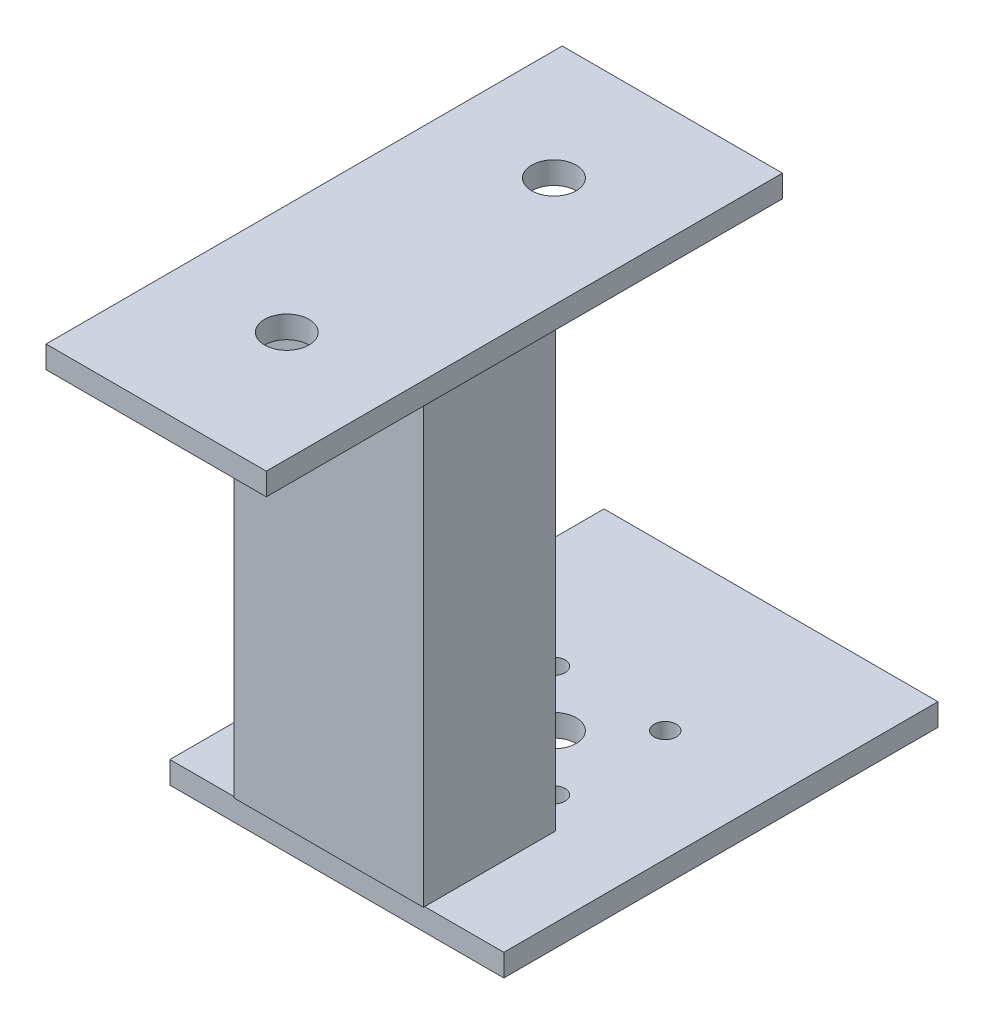
ISO-10303-21;
HEADER;
FILE_DESCRIPTION(('STEP AP214'),'2;1');
FILE_NAME('part.step','',(''),(''),'','','');
FILE_SCHEMA(('AUTOMOTIVE_DESIGN { 1 0 10303 214 1 1 1 1 }'));
ENDSEC;
DATA;
#1=APPLICATION_CONTEXT('core data for automotive mechanical design processes');
#2=APPLICATION_PROTOCOL_DEFINITION('international standard','automotive_design',2000,#1);
#3=PRODUCT_CONTEXT('',#1,'mechanical');
#4=PRODUCT('Part','Part','',(#3));
#5=PRODUCT_RELATED_PRODUCT_CATEGORY('part','',(#4));
#6=PRODUCT_DEFINITION_FORMATION('','',#4);
#7=PRODUCT_DEFINITION_CONTEXT('part definition',#1,'design');
#8=PRODUCT_DEFINITION('design','',#6,#7);
#9=PRODUCT_DEFINITION_SHAPE('','',#8);
#10=(LENGTH_UNIT() NAMED_UNIT(*) SI_UNIT(.MILLI.,.METRE.));
#11=(NAMED_UNIT(*) PLANE_ANGLE_UNIT() SI_UNIT($,.RADIAN.));
#12=(NAMED_UNIT(*) SI_UNIT($,.STERADIAN.) SOLID_ANGLE_UNIT());
#13=UNCERTAINTY_MEASURE_WITH_UNIT(LENGTH_MEASURE(1.E-05),#10,'distance_accuracy_value','');
#14=(GEOMETRIC_REPRESENTATION_CONTEXT(3) GLOBAL_UNCERTAINTY_ASSIGNED_CONTEXT((#13)) GLOBAL_UNIT_ASSIGNED_CONTEXT((#10,
#11,#12)) REPRESENTATION_CONTEXT('',''));
#15=CARTESIAN_POINT('',(0.,0.,0.));
#16=DIRECTION('',(0.,0.,1.));
#17=DIRECTION('',(1.,0.,0.));
#18=AXIS2_PLACEMENT_3D('',#15,#16,#17);
#19=CARTESIAN_POINT('',(0.113330372670362,45.,0.));
#20=DIRECTION('',(-1.,0.,0.));
#21=DIRECTION('',(0.,0.,1.));
#22=AXIS2_PLACEMENT_3D('',#19,#20,#21);
#23=PLANE('',#22);
#24=DIRECTION('',(0.,-1.,0.));
#25=VECTOR('',#24,1.);
#26=CARTESIAN_POINT('',(0.113330372670362,45.,0.115649147058861));
#27=LINE('',#26,#25);
#28=CARTESIAN_POINT('',(0.113330372670362,43.,0.115649147058861));
#29=VERTEX_POINT('',#28);
#30=CARTESIAN_POINT('',(0.113330372670362,2.,0.115649147058861));
#31=VERTEX_POINT('',#30);
#32=EDGE_CURVE('E213',#29,#31,#27,.T.);
#33=ORIENTED_EDGE('',*,*,#32,.F.);
#34=DIRECTION('',(0.,0.,1.));
#35=VECTOR('',#34,1.);
#36=CARTESIAN_POINT('',(0.113330372670362,43.,0.));
#37=LINE('',#36,#35);
#38=CARTESIAN_POINT('',(0.113330372670362,43.,-11.7769551016806));
#39=VERTEX_POINT('',#38);
#40=EDGE_CURVE('E170',#39,#29,#37,.T.);
#41=ORIENTED_EDGE('',*,*,#40,.F.);
#42=DIRECTION('',(0.,-1.,0.));
#43=VECTOR('',#42,1.);
#44=CARTESIAN_POINT('',(0.113330372670362,45.,-11.7769551016806));
#45=LINE('',#44,#43);
#46=CARTESIAN_POINT('',(0.113330372670362,2.,-11.7769551016806));
#47=VERTEX_POINT('',#46);
#48=EDGE_CURVE('E65',#39,#47,#45,.T.);
#49=ORIENTED_EDGE('',*,*,#48,.T.);
#50=DIRECTION('',(0.,0.,-1.));
#51=VECTOR('',#50,1.);
#52=CARTESIAN_POINT('',(0.113330372670362,2.,0.));
#53=LINE('',#52,#51);
#54=CARTESIAN_POINT('',(0.113330372670362,2.,0.));
#55=VERTEX_POINT('',#54);
#56=EDGE_CURVE('E11',#55,#47,#53,.T.);
#57=ORIENTED_EDGE('',*,*,#56,.F.);
#58=EDGE_CURVE('E50',#31,#55,#53,.T.);
#59=ORIENTED_EDGE('',*,*,#58,.F.);
#60=EDGE_LOOP('',(#33,#41,#49,#57,#59));
#61=FACE_BOUND('',#60,.T.);
#62=ADVANCED_FACE('F39',(#61),#23,.T.);
#63=CARTESIAN_POINT('',(0.,45.,0.115649147058861));
#64=DIRECTION('',(0.,0.,-1.));
#65=DIRECTION('',(-1.,0.,0.));
#66=AXIS2_PLACEMENT_3D('',#63,#64,#65);
#67=PLANE('',#66);
#68=DIRECTION('',(1.,0.,0.));
#69=VECTOR('',#68,1.);
#70=CARTESIAN_POINT('',(0.,43.,0.115649147058861));
#71=LINE('',#70,#69);
#72=CARTESIAN_POINT('',(17.1359107011391,43.,0.115649147058861));
#73=VERTEX_POINT('',#72);
#74=EDGE_CURVE('E175',#29,#73,#71,.T.);
#75=ORIENTED_EDGE('',*,*,#74,.F.);
#76=ORIENTED_EDGE('',*,*,#32,.T.);
#77=DIRECTION('',(1.,0.,0.));
#78=VECTOR('',#77,1.);
#79=CARTESIAN_POINT('',(0.,2.,0.115649147058861));
#80=LINE('',#79,#78);
#81=CARTESIAN_POINT('',(17.1359107011391,2.,0.115649147058861));
#82=VERTEX_POINT('',#81);
#83=EDGE_CURVE('E199',#31,#82,#80,.T.);
#84=ORIENTED_EDGE('',*,*,#83,.T.);
#85=DIRECTION('',(0.,-1.,0.));
#86=VECTOR('',#85,1.);
#87=CARTESIAN_POINT('',(17.1359107011391,45.,0.115649147058861));
#88=LINE('',#87,#86);
#89=EDGE_CURVE('E211',#73,#82,#88,.T.);
#90=ORIENTED_EDGE('',*,*,#89,.F.);
#91=EDGE_LOOP('',(#75,#76,#84,#90));
#92=FACE_BOUND('',#91,.T.);
#93=ADVANCED_FACE('F316',(#92),#67,.F.);
#94=CARTESIAN_POINT('',(17.1359107011391,45.,0.));
#95=DIRECTION('',(-1.,0.,0.));
#96=DIRECTION('',(0.,0.,1.));
#97=AXIS2_PLACEMENT_3D('',#94,#95,#96);
#98=PLANE('',#97);
#99=DIRECTION('',(0.,0.,-1.));
#100=VECTOR('',#99,1.);
#101=CARTESIAN_POINT('',(17.1359107011391,43.,0.));
#102=LINE('',#101,#100);
#103=CARTESIAN_POINT('',(17.1359107011391,43.,-11.7769551016806));
#104=VERTEX_POINT('',#103);
#105=EDGE_CURVE('E57',#73,#104,#102,.T.);
#106=ORIENTED_EDGE('',*,*,#105,.F.);
#107=ORIENTED_EDGE('',*,*,#89,.T.);
#108=DIRECTION('',(0.,0.,-1.));
#109=VECTOR('',#108,1.);
#110=CARTESIAN_POINT('',(17.1359107011391,2.,0.));
#111=LINE('',#110,#109);
#112=CARTESIAN_POINT('',(17.1359107011391,2.,0.));
#113=VERTEX_POINT('',#112);
#114=EDGE_CURVE('E202',#82,#113,#111,.T.);
#115=ORIENTED_EDGE('',*,*,#114,.T.);
#116=CARTESIAN_POINT('',(17.1359107011391,2.,-11.7769551016806));
#117=VERTEX_POINT('',#116);
#118=EDGE_CURVE('E48',#113,#117,#111,.T.);
#119=ORIENTED_EDGE('',*,*,#118,.T.);
#120=DIRECTION('',(0.,-1.,0.));
#121=VECTOR('',#120,1.);
#122=CARTESIAN_POINT('',(17.1359107011391,45.,-11.7769551016806));
#123=LINE('',#122,#121);
#124=EDGE_CURVE('E209',#104,#117,#123,.T.);
#125=ORIENTED_EDGE('',*,*,#124,.F.);
#126=EDGE_LOOP('',(#106,#107,#115,#119,#125));
#127=FACE_BOUND('',#126,.T.);
#128=ADVANCED_FACE('F283',(#127),#98,.F.);
#129=CARTESIAN_POINT('',(0.,45.,-11.7769551016806));
#130=DIRECTION('',(0.,0.,-1.));
#131=DIRECTION('',(-1.,0.,0.));
#132=AXIS2_PLACEMENT_3D('',#129,#130,#131);
#133=PLANE('',#132);
#134=ORIENTED_EDGE('',*,*,#48,.F.);
#135=DIRECTION('',(-1.,0.,0.));
#136=VECTOR('',#135,1.);
#137=CARTESIAN_POINT('',(0.,43.,-11.7769551016806));
#138=LINE('',#137,#136);
#139=EDGE_CURVE('E172',#104,#39,#138,.T.);
#140=ORIENTED_EDGE('',*,*,#139,.F.);
#141=ORIENTED_EDGE('',*,*,#124,.T.);
#142=DIRECTION('',(1.,0.,0.));
#143=VECTOR('',#142,1.);
#144=CARTESIAN_POINT('',(0.,2.,-11.7769551016806));
#145=LINE('',#144,#143);
#146=EDGE_CURVE('E205',#47,#117,#145,.T.);
#147=ORIENTED_EDGE('',*,*,#146,.F.);
#148=EDGE_LOOP('',(#134,#140,#141,#147));
#149=FACE_BOUND('',#148,.T.);
#150=ADVANCED_FACE('F328',(#149),#133,.T.);
#151=CARTESIAN_POINT('',(0.,2.,0.));
#152=DIRECTION('',(0.,1.,0.));
#153=DIRECTION('',(0.,0.,1.));
#154=AXIS2_PLACEMENT_3D('',#151,#152,#153);
#155=PLANE('',#154);
#156=CARTESIAN_POINT('',(14.25,2.,-24.5));
#157=DIRECTION('',(0.,1.,0.));
#158=DIRECTION('',(0.,0.,1.));
#159=AXIS2_PLACEMENT_3D('',#156,#157,#158);
#160=CIRCLE('',#159,0.999999999999999);
#161=CARTESIAN_POINT('',(14.25,2.,-23.5));
#162=VERTEX_POINT('',#161);
#163=EDGE_CURVE('E229',#162,#162,#160,.T.);
#164=ORIENTED_EDGE('',*,*,#163,.F.);
#165=EDGE_LOOP('',(#164));
#166=FACE_BOUND('',#165,.T.);
#167=CARTESIAN_POINT('',(4.25000000000003,2.,-24.5));
#168=DIRECTION('',(0.,1.,0.));
#169=DIRECTION('',(0.,0.,1.));
#170=AXIS2_PLACEMENT_3D('',#167,#168,#169);
#171=CIRCLE('',#170,1.);
#172=CARTESIAN_POINT('',(4.25000000000003,2.,-23.5));
#173=VERTEX_POINT('',#172);
#174=EDGE_CURVE('E232',#173,#173,#171,.T.);
#175=ORIENTED_EDGE('',*,*,#174,.F.);
#176=EDGE_LOOP('',(#175));
#177=FACE_BOUND('',#176,.T.);
#178=CARTESIAN_POINT('',(9.24999999999999,2.,-19.5));
#179=DIRECTION('',(0.,1.,0.));
#180=DIRECTION('',(0.,0.,1.));
#181=AXIS2_PLACEMENT_3D('',#178,#179,#180);
#182=CIRCLE('',#181,2.);
#183=CARTESIAN_POINT('',(9.24999999999999,2.,-17.5));
#184=VERTEX_POINT('',#183);
#185=EDGE_CURVE('E235',#184,#184,#182,.T.);
#186=ORIENTED_EDGE('',*,*,#185,.F.);
#187=EDGE_LOOP('',(#186));
#188=FACE_BOUND('',#187,.T.);
#189=CARTESIAN_POINT('',(14.25,2.,-14.5));
#190=DIRECTION('',(0.,1.,0.));
#191=DIRECTION('',(0.,0.,1.));
#192=AXIS2_PLACEMENT_3D('',#189,#190,#191);
#193=CIRCLE('',#192,1.);
#194=CARTESIAN_POINT('',(14.25,2.,-13.5));
#195=VERTEX_POINT('',#194);
#196=EDGE_CURVE('E238',#195,#195,#193,.T.);
#197=ORIENTED_EDGE('',*,*,#196,.F.);
#198=EDGE_LOOP('',(#197));
#199=FACE_BOUND('',#198,.T.);
#200=CARTESIAN_POINT('',(4.24999999999997,2.,-14.5));
#201=DIRECTION('',(0.,1.,0.));
#202=DIRECTION('',(0.,0.,1.));
#203=AXIS2_PLACEMENT_3D('',#200,#201,#202);
#204=CIRCLE('',#203,1.);
#205=CARTESIAN_POINT('',(4.24999999999997,2.,-13.5));
#206=VERTEX_POINT('',#205);
#207=EDGE_CURVE('E241',#206,#206,#204,.T.);
#208=ORIENTED_EDGE('',*,*,#207,.F.);
#209=EDGE_LOOP('',(#208));
#210=FACE_BOUND('',#209,.T.);
#211=DIRECTION('',(-1.,0.,0.));
#212=VECTOR('',#211,1.);
#213=CARTESIAN_POINT('',(0.,2.,0.));
#214=LINE('',#213,#212);
#215=CARTESIAN_POINT('',(-5.75000000000001,2.,0.));
#216=VERTEX_POINT('',#215);
#217=EDGE_CURVE('E221',#55,#216,#214,.T.);
#218=ORIENTED_EDGE('',*,*,#217,.F.);
#219=ORIENTED_EDGE('',*,*,#56,.T.);
#220=ORIENTED_EDGE('',*,*,#146,.T.);
#221=ORIENTED_EDGE('',*,*,#118,.F.);
#222=CARTESIAN_POINT('',(24.25,2.,0.));
#223=VERTEX_POINT('',#222);
#224=EDGE_CURVE('E216',#223,#113,#214,.T.);
#225=ORIENTED_EDGE('',*,*,#224,.F.);
#226=DIRECTION('',(0.,0.,-1.));
#227=VECTOR('',#226,1.);
#228=CARTESIAN_POINT('',(24.25,2.,0.));
#229=LINE('',#228,#227);
#230=CARTESIAN_POINT('',(24.25,2.,-39.));
#231=VERTEX_POINT('',#230);
#232=EDGE_CURVE('E219',#223,#231,#229,.T.);
#233=ORIENTED_EDGE('',*,*,#232,.T.);
#234=DIRECTION('',(1.,0.,0.));
#235=VECTOR('',#234,1.);
#236=CARTESIAN_POINT('',(0.,2.,-39.));
#237=LINE('',#236,#235);
#238=CARTESIAN_POINT('',(-5.75000000000002,2.,-39.));
#239=VERTEX_POINT('',#238);
#240=EDGE_CURVE('E223',#239,#231,#237,.T.);
#241=ORIENTED_EDGE('',*,*,#240,.F.);
#242=DIRECTION('',(0.,0.,-1.));
#243=VECTOR('',#242,1.);
#244=CARTESIAN_POINT('',(-5.75000000000001,2.,0.));
#245=LINE('',#244,#243);
#246=EDGE_CURVE('E226',#216,#239,#245,.T.);
#247=ORIENTED_EDGE('',*,*,#246,.F.);
#248=EDGE_LOOP('',(#218,#219,#220,#221,#225,#233,#241,#247));
#249=FACE_BOUND('',#248,.T.);
#250=ADVANCED_FACE('F287',(#166,#177,#188,#199,#210,#249),#155,.T.);
#251=CARTESIAN_POINT('',(0.,2.,0.));
#252=DIRECTION('',(0.,0.,1.));
#253=DIRECTION('',(1.,0.,0.));
#254=AXIS2_PLACEMENT_3D('',#251,#252,#253);
#255=PLANE('',#254);
#256=DIRECTION('',(-1.,0.,0.));
#257=VECTOR('',#256,1.);
#258=CARTESIAN_POINT('',(0.,0.,0.));
#259=LINE('',#258,#257);
#260=CARTESIAN_POINT('',(24.25,0.,0.));
#261=VERTEX_POINT('',#260);
#262=CARTESIAN_POINT('',(-5.75000000000001,0.,0.));
#263=VERTEX_POINT('',#262);
#264=EDGE_CURVE('E215',#261,#263,#259,.T.);
#265=ORIENTED_EDGE('',*,*,#264,.F.);
#266=DIRECTION('',(0.,-1.,0.));
#267=VECTOR('',#266,1.);
#268=CARTESIAN_POINT('',(24.25,2.,0.));
#269=LINE('',#268,#267);
#270=EDGE_CURVE('E43',#223,#261,#269,.T.);
#271=ORIENTED_EDGE('',*,*,#270,.F.);
#272=ORIENTED_EDGE('',*,*,#224,.T.);
#273=EDGE_CURVE('E220',#113,#55,#214,.T.);
#274=ORIENTED_EDGE('',*,*,#273,.T.);
#275=ORIENTED_EDGE('',*,*,#217,.T.);
#276=DIRECTION('',(0.,-1.,0.));
#277=VECTOR('',#276,1.);
#278=CARTESIAN_POINT('',(-5.75000000000001,2.,0.));
#279=LINE('',#278,#277);
#280=EDGE_CURVE('E244',#216,#263,#279,.T.);
#281=ORIENTED_EDGE('',*,*,#280,.T.);
#282=EDGE_LOOP('',(#265,#271,#272,#274,#275,#281));
#283=FACE_BOUND('',#282,.T.);
#284=ADVANCED_FACE('F41',(#283),#255,.T.);
#285=CARTESIAN_POINT('',(24.25,2.,0.));
#286=DIRECTION('',(-1.,0.,0.));
#287=DIRECTION('',(0.,0.,1.));
#288=AXIS2_PLACEMENT_3D('',#285,#286,#287);
#289=PLANE('',#288);
#290=DIRECTION('',(0.,0.,-1.));
#291=VECTOR('',#290,1.);
#292=CARTESIAN_POINT('',(24.25,0.,0.));
#293=LINE('',#292,#291);
#294=CARTESIAN_POINT('',(24.25,0.,-39.));
#295=VERTEX_POINT('',#294);
#296=EDGE_CURVE('E247',#261,#295,#293,.T.);
#297=ORIENTED_EDGE('',*,*,#296,.T.);
#298=DIRECTION('',(0.,-1.,0.));
#299=VECTOR('',#298,1.);
#300=CARTESIAN_POINT('',(24.25,2.,-39.));
#301=LINE('',#300,#299);
#302=EDGE_CURVE('E273',#231,#295,#301,.T.);
#303=ORIENTED_EDGE('',*,*,#302,.F.);
#304=ORIENTED_EDGE('',*,*,#232,.F.);
#305=ORIENTED_EDGE('',*,*,#270,.T.);
#306=EDGE_LOOP('',(#297,#303,#304,#305));
#307=FACE_BOUND('',#306,.T.);
#308=ADVANCED_FACE('F307',(#307),#289,.F.);
#309=CARTESIAN_POINT('',(0.,2.,-39.));
#310=DIRECTION('',(0.,0.,-1.));
#311=DIRECTION('',(-1.,0.,0.));
#312=AXIS2_PLACEMENT_3D('',#309,#310,#311);
#313=PLANE('',#312);
#314=DIRECTION('',(1.,0.,0.));
#315=VECTOR('',#314,1.);
#316=CARTESIAN_POINT('',(0.,0.,-39.));
#317=LINE('',#316,#315);
#318=CARTESIAN_POINT('',(-5.75000000000002,0.,-39.));
#319=VERTEX_POINT('',#318);
#320=EDGE_CURVE('E250',#319,#295,#317,.T.);
#321=ORIENTED_EDGE('',*,*,#320,.F.);
#322=DIRECTION('',(0.,-1.,0.));
#323=VECTOR('',#322,1.);
#324=CARTESIAN_POINT('',(-5.75000000000002,2.,-39.));
#325=LINE('',#324,#323);
#326=EDGE_CURVE('E272',#239,#319,#325,.T.);
#327=ORIENTED_EDGE('',*,*,#326,.F.);
#328=ORIENTED_EDGE('',*,*,#240,.T.);
#329=ORIENTED_EDGE('',*,*,#302,.T.);
#330=EDGE_LOOP('',(#321,#327,#328,#329));
#331=FACE_BOUND('',#330,.T.);
#332=ADVANCED_FACE('F303',(#331),#313,.T.);
#333=CARTESIAN_POINT('',(14.25,2.,-14.5));
#334=DIRECTION('',(0.,-1.,0.));
#335=DIRECTION('',(0.,0.,-1.));
#336=AXIS2_PLACEMENT_3D('',#333,#334,#335);
#337=CYLINDRICAL_SURFACE('',#336,1.);
#338=ORIENTED_EDGE('',*,*,#196,.T.);
#339=EDGE_LOOP('',(#338));
#340=FACE_BOUND('',#339,.T.);
#341=CARTESIAN_POINT('',(14.25,0.,-14.5));
#342=DIRECTION('',(0.,1.,0.));
#343=DIRECTION('',(0.,0.,1.));
#344=AXIS2_PLACEMENT_3D('',#341,#342,#343);
#345=CIRCLE('',#344,1.);
#346=CARTESIAN_POINT('',(14.25,0.,-13.5));
#347=VERTEX_POINT('',#346);
#348=EDGE_CURVE('E265',#347,#347,#345,.T.);
#349=ORIENTED_EDGE('',*,*,#348,.F.);
#350=EDGE_LOOP('',(#349));
#351=FACE_BOUND('',#350,.T.);
#352=ADVANCED_FACE('F313',(#340,#351),#337,.F.);
#353=CARTESIAN_POINT('',(9.24999999999999,2.,-19.5));
#354=DIRECTION('',(0.,-1.,0.));
#355=DIRECTION('',(0.,0.,-1.));
#356=AXIS2_PLACEMENT_3D('',#353,#354,#355);
#357=CYLINDRICAL_SURFACE('',#356,2.);
#358=ORIENTED_EDGE('',*,*,#185,.T.);
#359=EDGE_LOOP('',(#358));
#360=FACE_BOUND('',#359,.T.);
#361=CARTESIAN_POINT('',(9.24999999999999,0.,-19.5));
#362=DIRECTION('',(0.,1.,0.));
#363=DIRECTION('',(0.,0.,1.));
#364=AXIS2_PLACEMENT_3D('',#361,#362,#363);
#365=CIRCLE('',#364,2.);
#366=CARTESIAN_POINT('',(9.24999999999999,0.,-17.5));
#367=VERTEX_POINT('',#366);
#368=EDGE_CURVE('E262',#367,#367,#365,.T.);
#369=ORIENTED_EDGE('',*,*,#368,.F.);
#370=EDGE_LOOP('',(#369));
#371=FACE_BOUND('',#370,.T.);
#372=ADVANCED_FACE('F338',(#360,#371),#357,.F.);
#373=CARTESIAN_POINT('',(4.25000000000003,2.,-24.5));
#374=DIRECTION('',(0.,-1.,0.));
#375=DIRECTION('',(0.,0.,-1.));
#376=AXIS2_PLACEMENT_3D('',#373,#374,#375);
#377=CYLINDRICAL_SURFACE('',#376,1.);
#378=ORIENTED_EDGE('',*,*,#174,.T.);
#379=EDGE_LOOP('',(#378));
#380=FACE_BOUND('',#379,.T.);
#381=CARTESIAN_POINT('',(4.25000000000003,0.,-24.5));
#382=DIRECTION('',(0.,1.,0.));
#383=DIRECTION('',(0.,0.,1.));
#384=AXIS2_PLACEMENT_3D('',#381,#382,#383);
#385=CIRCLE('',#384,1.);
#386=CARTESIAN_POINT('',(4.25000000000003,0.,-23.5));
#387=VERTEX_POINT('',#386);
#388=EDGE_CURVE('E259',#387,#387,#385,.T.);
#389=ORIENTED_EDGE('',*,*,#388,.F.);
#390=EDGE_LOOP('',(#389));
#391=FACE_BOUND('',#390,.T.);
#392=ADVANCED_FACE('F342',(#380,#391),#377,.F.);
#393=CARTESIAN_POINT('',(14.25,2.,-24.5));
#394=DIRECTION('',(0.,-1.,0.));
#395=DIRECTION('',(0.,0.,-1.));
#396=AXIS2_PLACEMENT_3D('',#393,#394,#395);
#397=CYLINDRICAL_SURFACE('',#396,0.999999999999999);
#398=ORIENTED_EDGE('',*,*,#163,.T.);
#399=EDGE_LOOP('',(#398));
#400=FACE_BOUND('',#399,.T.);
#401=CARTESIAN_POINT('',(14.25,0.,-24.5));
#402=DIRECTION('',(0.,1.,0.));
#403=DIRECTION('',(0.,0.,1.));
#404=AXIS2_PLACEMENT_3D('',#401,#402,#403);
#405=CIRCLE('',#404,0.999999999999999);
#406=CARTESIAN_POINT('',(14.25,0.,-23.5));
#407=VERTEX_POINT('',#406);
#408=EDGE_CURVE('E256',#407,#407,#405,.T.);
#409=ORIENTED_EDGE('',*,*,#408,.F.);
#410=EDGE_LOOP('',(#409));
#411=FACE_BOUND('',#410,.T.);
#412=ADVANCED_FACE('F346',(#400,#411),#397,.F.);
#413=CARTESIAN_POINT('',(-5.75000000000001,2.,0.));
#414=DIRECTION('',(-1.,0.,0.));
#415=DIRECTION('',(0.,0.,1.));
#416=AXIS2_PLACEMENT_3D('',#413,#414,#415);
#417=PLANE('',#416);
#418=DIRECTION('',(0.,0.,-1.));
#419=VECTOR('',#418,1.);
#420=CARTESIAN_POINT('',(-5.75000000000001,0.,0.));
#421=LINE('',#420,#419);
#422=EDGE_CURVE('E253',#263,#319,#421,.T.);
#423=ORIENTED_EDGE('',*,*,#422,.F.);
#424=ORIENTED_EDGE('',*,*,#280,.F.);
#425=ORIENTED_EDGE('',*,*,#246,.T.);
#426=ORIENTED_EDGE('',*,*,#326,.T.);
#427=EDGE_LOOP('',(#423,#424,#425,#426));
#428=FACE_BOUND('',#427,.T.);
#429=ADVANCED_FACE('F301',(#428),#417,.T.);
#430=CARTESIAN_POINT('',(4.24999999999997,2.,-14.5));
#431=DIRECTION('',(0.,-1.,0.));
#432=DIRECTION('',(0.,0.,-1.));
#433=AXIS2_PLACEMENT_3D('',#430,#431,#432);
#434=CYLINDRICAL_SURFACE('',#433,1.);
#435=ORIENTED_EDGE('',*,*,#207,.T.);
#436=EDGE_LOOP('',(#435));
#437=FACE_BOUND('',#436,.T.);
#438=CARTESIAN_POINT('',(4.24999999999997,0.,-14.5));
#439=DIRECTION('',(0.,1.,0.));
#440=DIRECTION('',(0.,0.,1.));
#441=AXIS2_PLACEMENT_3D('',#438,#439,#440);
#442=CIRCLE('',#441,1.);
#443=CARTESIAN_POINT('',(4.24999999999997,0.,-13.5));
#444=VERTEX_POINT('',#443);
#445=EDGE_CURVE('E268',#444,#444,#442,.T.);
#446=ORIENTED_EDGE('',*,*,#445,.F.);
#447=EDGE_LOOP('',(#446));
#448=FACE_BOUND('',#447,.T.);
#449=ADVANCED_FACE('F332',(#437,#448),#434,.F.);
#450=CARTESIAN_POINT('',(0.,0.,0.));
#451=DIRECTION('',(0.,1.,0.));
#452=DIRECTION('',(0.,0.,1.));
#453=AXIS2_PLACEMENT_3D('',#450,#451,#452);
#454=PLANE('',#453);
#455=ORIENTED_EDGE('',*,*,#264,.T.);
#456=ORIENTED_EDGE('',*,*,#422,.T.);
#457=ORIENTED_EDGE('',*,*,#320,.T.);
#458=ORIENTED_EDGE('',*,*,#296,.F.);
#459=EDGE_LOOP('',(#455,#456,#457,#458));
#460=FACE_BOUND('',#459,.T.);
#461=ORIENTED_EDGE('',*,*,#408,.T.);
#462=EDGE_LOOP('',(#461));
#463=FACE_BOUND('',#462,.T.);
#464=ORIENTED_EDGE('',*,*,#388,.T.);
#465=EDGE_LOOP('',(#464));
#466=FACE_BOUND('',#465,.T.);
#467=ORIENTED_EDGE('',*,*,#368,.T.);
#468=EDGE_LOOP('',(#467));
#469=FACE_BOUND('',#468,.T.);
#470=ORIENTED_EDGE('',*,*,#348,.T.);
#471=EDGE_LOOP('',(#470));
#472=FACE_BOUND('',#471,.T.);
#473=ORIENTED_EDGE('',*,*,#445,.T.);
#474=EDGE_LOOP('',(#473));
#475=FACE_BOUND('',#474,.T.);
#476=ADVANCED_FACE('F305',(#460,#463,#466,#469,#472,#475),#454,.F.);
#477=CARTESIAN_POINT('',(0.,2.,0.));
#478=DIRECTION('',(0.,1.,0.));
#479=DIRECTION('',(0.,0.,1.));
#480=AXIS2_PLACEMENT_3D('',#477,#478,#479);
#481=PLANE('',#480);
#482=ORIENTED_EDGE('',*,*,#273,.F.);
#483=ORIENTED_EDGE('',*,*,#114,.F.);
#484=ORIENTED_EDGE('',*,*,#83,.F.);
#485=ORIENTED_EDGE('',*,*,#58,.T.);
#486=EDGE_LOOP('',(#482,#483,#484,#485));
#487=FACE_BOUND('',#486,.T.);
#488=ADVANCED_FACE('F294',(#487),#481,.F.);
#489=CARTESIAN_POINT('',(-0.643100003960378,43.,0.));
#490=DIRECTION('',(1.,0.,0.));
#491=DIRECTION('',(0.,0.,-1.));
#492=AXIS2_PLACEMENT_3D('',#489,#490,#491);
#493=PLANE('',#492);
#494=DIRECTION('',(0.,0.,-1.));
#495=VECTOR('',#494,1.);
#496=CARTESIAN_POINT('',(-0.643100003960378,45.,0.));
#497=LINE('',#496,#495);
#498=CARTESIAN_POINT('',(-0.643100003960378,45.,16.2352326791861));
#499=VERTEX_POINT('',#498);
#500=CARTESIAN_POINT('',(-0.643100003960378,45.,-30.1380604420363));
#501=VERTEX_POINT('',#500);
#502=EDGE_CURVE('E182',#499,#501,#497,.T.);
#503=ORIENTED_EDGE('',*,*,#502,.T.);
#504=DIRECTION('',(0.,1.,0.));
#505=VECTOR('',#504,1.);
#506=CARTESIAN_POINT('',(-0.643100003960378,43.,-30.1380604420363));
#507=LINE('',#506,#505);
#508=CARTESIAN_POINT('',(-0.643100003960378,43.,-30.1380604420363));
#509=VERTEX_POINT('',#508);
#510=EDGE_CURVE('E154',#509,#501,#507,.T.);
#511=ORIENTED_EDGE('',*,*,#510,.F.);
#512=DIRECTION('',(0.,0.,-1.));
#513=VECTOR('',#512,1.);
#514=CARTESIAN_POINT('',(-0.643100003960378,43.,0.));
#515=LINE('',#514,#513);
#516=CARTESIAN_POINT('',(-0.643100003960378,43.,16.2352326791861));
#517=VERTEX_POINT('',#516);
#518=EDGE_CURVE('E152',#517,#509,#515,.T.);
#519=ORIENTED_EDGE('',*,*,#518,.F.);
#520=DIRECTION('',(0.,1.,0.));
#521=VECTOR('',#520,1.);
#522=CARTESIAN_POINT('',(-0.643100003960378,43.,16.2352326791861));
#523=LINE('',#522,#521);
#524=EDGE_CURVE('E138',#517,#499,#523,.T.);
#525=ORIENTED_EDGE('',*,*,#524,.T.);
#526=EDGE_LOOP('',(#503,#511,#519,#525));
#527=FACE_BOUND('',#526,.T.);
#528=ADVANCED_FACE('F153',(#527),#493,.F.);
#529=CARTESIAN_POINT('',(0.,43.,-30.1380604420363));
#530=DIRECTION('',(0.,0.,-1.));
#531=DIRECTION('',(-1.,0.,0.));
#532=AXIS2_PLACEMENT_3D('',#529,#530,#531);
#533=PLANE('',#532);
#534=DIRECTION('',(-1.,0.,0.));
#535=VECTOR('',#534,1.);
#536=CARTESIAN_POINT('',(0.,45.,-30.1380604420363));
#537=LINE('',#536,#535);
#538=CARTESIAN_POINT('',(19.1431000039604,45.,-30.1380604420363));
#539=VERTEX_POINT('',#538);
#540=EDGE_CURVE('E188',#539,#501,#537,.T.);
#541=ORIENTED_EDGE('',*,*,#540,.F.);
#542=DIRECTION('',(0.,1.,0.));
#543=VECTOR('',#542,1.);
#544=CARTESIAN_POINT('',(19.1431000039604,43.,-30.1380604420363));
#545=LINE('',#544,#543);
#546=CARTESIAN_POINT('',(19.1431000039604,43.,-30.1380604420363));
#547=VERTEX_POINT('',#546);
#548=EDGE_CURVE('E195',#547,#539,#545,.T.);
#549=ORIENTED_EDGE('',*,*,#548,.F.);
#550=DIRECTION('',(-1.,0.,0.));
#551=VECTOR('',#550,1.);
#552=CARTESIAN_POINT('',(0.,43.,-30.1380604420363));
#553=LINE('',#552,#551);
#554=EDGE_CURVE('E165',#547,#509,#553,.T.);
#555=ORIENTED_EDGE('',*,*,#554,.T.);
#556=ORIENTED_EDGE('',*,*,#510,.T.);
#557=EDGE_LOOP('',(#541,#549,#555,#556));
#558=FACE_BOUND('',#557,.T.);
#559=ADVANCED_FACE('F378',(#558),#533,.T.);
#560=CARTESIAN_POINT('',(19.1431000039604,43.,0.));
#561=DIRECTION('',(1.,0.,0.));
#562=DIRECTION('',(0.,0.,-1.));
#563=AXIS2_PLACEMENT_3D('',#560,#561,#562);
#564=PLANE('',#563);
#565=DIRECTION('',(0.,0.,-1.));
#566=VECTOR('',#565,1.);
#567=CARTESIAN_POINT('',(19.1431000039604,45.,0.));
#568=LINE('',#567,#566);
#569=CARTESIAN_POINT('',(19.1431000039604,45.,16.2352326791861));
#570=VERTEX_POINT('',#569);
#571=EDGE_CURVE('E185',#570,#539,#568,.T.);
#572=ORIENTED_EDGE('',*,*,#571,.F.);
#573=DIRECTION('',(0.,1.,0.));
#574=VECTOR('',#573,1.);
#575=CARTESIAN_POINT('',(19.1431000039604,43.,16.2352326791861));
#576=LINE('',#575,#574);
#577=CARTESIAN_POINT('',(19.1431000039604,43.,16.2352326791861));
#578=VERTEX_POINT('',#577);
#579=EDGE_CURVE('E148',#578,#570,#576,.T.);
#580=ORIENTED_EDGE('',*,*,#579,.F.);
#581=DIRECTION('',(0.,0.,-1.));
#582=VECTOR('',#581,1.);
#583=CARTESIAN_POINT('',(19.1431000039604,43.,0.));
#584=LINE('',#583,#582);
#585=EDGE_CURVE('E163',#578,#547,#584,.T.);
#586=ORIENTED_EDGE('',*,*,#585,.T.);
#587=ORIENTED_EDGE('',*,*,#548,.T.);
#588=EDGE_LOOP('',(#572,#580,#586,#587));
#589=FACE_BOUND('',#588,.T.);
#590=ADVANCED_FACE('F386',(#589),#564,.T.);
#591=CARTESIAN_POINT('',(0.,43.,16.2352326791861));
#592=DIRECTION('',(0.,0.,1.));
#593=DIRECTION('',(1.,0.,0.));
#594=AXIS2_PLACEMENT_3D('',#591,#592,#593);
#595=PLANE('',#594);
#596=DIRECTION('',(1.,0.,0.));
#597=VECTOR('',#596,1.);
#598=CARTESIAN_POINT('',(0.,45.,16.2352326791861));
#599=LINE('',#598,#597);
#600=EDGE_CURVE('E144',#499,#570,#599,.T.);
#601=ORIENTED_EDGE('',*,*,#600,.F.);
#602=ORIENTED_EDGE('',*,*,#524,.F.);
#603=DIRECTION('',(1.,0.,0.));
#604=VECTOR('',#603,1.);
#605=CARTESIAN_POINT('',(0.,43.,16.2352326791861));
#606=LINE('',#605,#604);
#607=EDGE_CURVE('E142',#517,#578,#606,.T.);
#608=ORIENTED_EDGE('',*,*,#607,.T.);
#609=ORIENTED_EDGE('',*,*,#579,.T.);
#610=EDGE_LOOP('',(#601,#602,#608,#609));
#611=FACE_BOUND('',#610,.T.);
#612=ADVANCED_FACE('F140',(#611),#595,.T.);
#613=CARTESIAN_POINT('',(9.24999999999999,43.,4.5));
#614=DIRECTION('',(0.,1.,0.));
#615=DIRECTION('',(0.,0.,1.));
#616=AXIS2_PLACEMENT_3D('',#613,#614,#615);
#617=CYLINDRICAL_SURFACE('',#616,2.);
#618=CARTESIAN_POINT('',(9.24999999999999,43.,4.5));
#619=DIRECTION('',(0.,1.,0.));
#620=DIRECTION('',(0.,0.,1.));
#621=AXIS2_PLACEMENT_3D('',#618,#619,#620);
#622=CIRCLE('',#621,2.);
#623=CARTESIAN_POINT('',(9.24999999999999,43.,6.5));
#624=VERTEX_POINT('',#623);
#625=EDGE_CURVE('E158',#624,#624,#622,.T.);
#626=ORIENTED_EDGE('',*,*,#625,.F.);
#627=EDGE_LOOP('',(#626));
#628=FACE_BOUND('',#627,.T.);
#629=CARTESIAN_POINT('',(9.24999999999999,45.,4.5));
#630=DIRECTION('',(0.,1.,0.));
#631=DIRECTION('',(0.,0.,1.));
#632=AXIS2_PLACEMENT_3D('',#629,#630,#631);
#633=CIRCLE('',#632,2.);
#634=CARTESIAN_POINT('',(9.24999999999999,45.,6.5));
#635=VERTEX_POINT('',#634);
#636=EDGE_CURVE('E179',#635,#635,#633,.T.);
#637=ORIENTED_EDGE('',*,*,#636,.T.);
#638=EDGE_LOOP('',(#637));
#639=FACE_BOUND('',#638,.T.);
#640=ADVANCED_FACE('F401',(#628,#639),#617,.F.);
#641=CARTESIAN_POINT('',(9.24999999999999,43.,-19.5));
#642=DIRECTION('',(0.,1.,0.));
#643=DIRECTION('',(0.,0.,1.));
#644=AXIS2_PLACEMENT_3D('',#641,#642,#643);
#645=CYLINDRICAL_SURFACE('',#644,2.);
#646=CARTESIAN_POINT('',(9.24999999999999,43.,-19.5));
#647=DIRECTION('',(0.,1.,0.));
#648=DIRECTION('',(0.,0.,1.));
#649=AXIS2_PLACEMENT_3D('',#646,#647,#648);
#650=CIRCLE('',#649,2.);
#651=CARTESIAN_POINT('',(9.24999999999999,43.,-17.5));
#652=VERTEX_POINT('',#651);
#653=EDGE_CURVE('E149',#652,#652,#650,.F.);
#654=ORIENTED_EDGE('',*,*,#653,.T.);
#655=EDGE_LOOP('',(#654));
#656=FACE_BOUND('',#655,.T.);
#657=CARTESIAN_POINT('',(9.24999999999999,45.,-19.5));
#658=DIRECTION('',(0.,1.,0.));
#659=DIRECTION('',(0.,0.,1.));
#660=AXIS2_PLACEMENT_3D('',#657,#658,#659);
#661=CIRCLE('',#660,2.);
#662=CARTESIAN_POINT('',(9.24999999999999,45.,-17.5));
#663=VERTEX_POINT('',#662);
#664=EDGE_CURVE('E191',#663,#663,#661,.F.);
#665=ORIENTED_EDGE('',*,*,#664,.F.);
#666=EDGE_LOOP('',(#665));
#667=FACE_BOUND('',#666,.T.);
#668=ADVANCED_FACE('F408',(#656,#667),#645,.F.);
#669=CARTESIAN_POINT('',(0.,43.,0.));
#670=DIRECTION('',(0.,1.,0.));
#671=DIRECTION('',(0.,0.,1.));
#672=AXIS2_PLACEMENT_3D('',#669,#670,#671);
#673=PLANE('',#672);
#674=ORIENTED_EDGE('',*,*,#625,.T.);
#675=EDGE_LOOP('',(#674));
#676=FACE_BOUND('',#675,.T.);
#677=ORIENTED_EDGE('',*,*,#518,.T.);
#678=ORIENTED_EDGE('',*,*,#554,.F.);
#679=ORIENTED_EDGE('',*,*,#585,.F.);
#680=ORIENTED_EDGE('',*,*,#607,.F.);
#681=EDGE_LOOP('',(#677,#678,#679,#680));
#682=FACE_BOUND('',#681,.T.);
#683=ORIENTED_EDGE('',*,*,#40,.T.);
#684=ORIENTED_EDGE('',*,*,#74,.T.);
#685=ORIENTED_EDGE('',*,*,#105,.T.);
#686=ORIENTED_EDGE('',*,*,#139,.T.);
#687=EDGE_LOOP('',(#683,#684,#685,#686));
#688=FACE_BOUND('',#687,.T.);
#689=ORIENTED_EDGE('',*,*,#653,.F.);
#690=EDGE_LOOP('',(#689));
#691=FACE_BOUND('',#690,.T.);
#692=ADVANCED_FACE('F161',(#676,#682,#688,#691),#673,.F.);
#693=CARTESIAN_POINT('',(0.,45.,0.));
#694=DIRECTION('',(0.,1.,0.));
#695=DIRECTION('',(0.,0.,1.));
#696=AXIS2_PLACEMENT_3D('',#693,#694,#695);
#697=PLANE('',#696);
#698=ORIENTED_EDGE('',*,*,#636,.F.);
#699=EDGE_LOOP('',(#698));
#700=FACE_BOUND('',#699,.T.);
#701=ORIENTED_EDGE('',*,*,#502,.F.);
#702=ORIENTED_EDGE('',*,*,#600,.T.);
#703=ORIENTED_EDGE('',*,*,#571,.T.);
#704=ORIENTED_EDGE('',*,*,#540,.T.);
#705=EDGE_LOOP('',(#701,#702,#703,#704));
#706=FACE_BOUND('',#705,.T.);
#707=ORIENTED_EDGE('',*,*,#664,.T.);
#708=EDGE_LOOP('',(#707));
#709=FACE_BOUND('',#708,.T.);
#710=ADVANCED_FACE('F423',(#700,#706,#709),#697,.T.);
#711=CLOSED_SHELL('',(#62,#93,#128,#150,#250,#284,#308,#332,#352,#372,#392,#412,#429,#449,#476,
#488,#528,#559,#590,#612,#640,#668,#692,#710));
#712=MANIFOLD_SOLID_BREP('B2',#711);
#713=ADVANCED_BREP_SHAPE_REPRESENTATION('',(#18,#712),#14);
#714=SHAPE_DEFINITION_REPRESENTATION(#9,#713);
ENDSEC;
END-ISO-10303-21;
